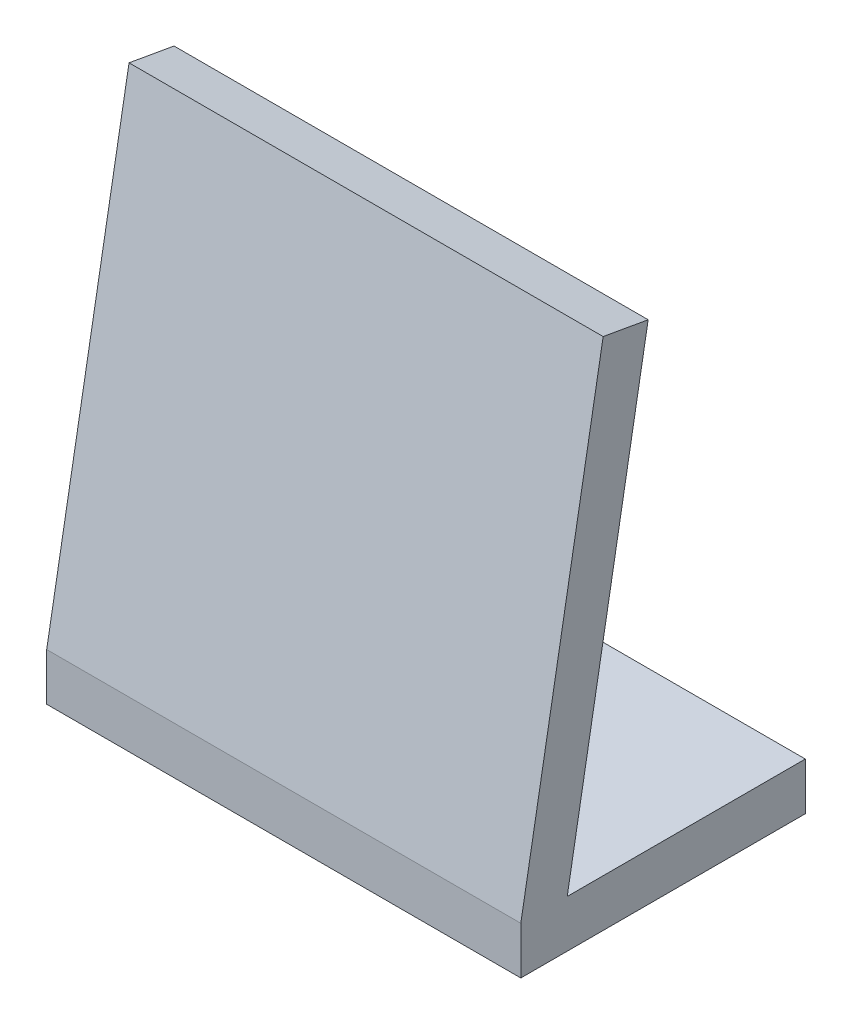
ISO-10303-21;
HEADER;
FILE_DESCRIPTION(('STEP AP214'),'2;1');
FILE_NAME('part.step','',(''),(''),'','','');
FILE_SCHEMA(('AUTOMOTIVE_DESIGN { 1 0 10303 214 1 1 1 1 }'));
ENDSEC;
DATA;
#1=APPLICATION_CONTEXT('core data for automotive mechanical design processes');
#2=APPLICATION_PROTOCOL_DEFINITION('international standard','automotive_design',2000,#1);
#3=PRODUCT_CONTEXT('',#1,'mechanical');
#4=PRODUCT('Part','Part','',(#3));
#5=PRODUCT_RELATED_PRODUCT_CATEGORY('part','',(#4));
#6=PRODUCT_DEFINITION_FORMATION('','',#4);
#7=PRODUCT_DEFINITION_CONTEXT('part definition',#1,'design');
#8=PRODUCT_DEFINITION('design','',#6,#7);
#9=PRODUCT_DEFINITION_SHAPE('','',#8);
#10=(LENGTH_UNIT() NAMED_UNIT(*) SI_UNIT(.MILLI.,.METRE.));
#11=(NAMED_UNIT(*) PLANE_ANGLE_UNIT() SI_UNIT($,.RADIAN.));
#12=(NAMED_UNIT(*) SI_UNIT($,.STERADIAN.) SOLID_ANGLE_UNIT());
#13=UNCERTAINTY_MEASURE_WITH_UNIT(LENGTH_MEASURE(1.E-05),#10,'distance_accuracy_value','');
#14=(GEOMETRIC_REPRESENTATION_CONTEXT(3) GLOBAL_UNCERTAINTY_ASSIGNED_CONTEXT((#13)) GLOBAL_UNIT_ASSIGNED_CONTEXT((#10,
#11,#12)) REPRESENTATION_CONTEXT('',''));
#15=CARTESIAN_POINT('',(0.,0.,0.));
#16=DIRECTION('',(0.,0.,1.));
#17=DIRECTION('',(1.,0.,0.));
#18=AXIS2_PLACEMENT_3D('',#15,#16,#17);
#19=CARTESIAN_POINT('',(-12.5,2.5,-7.5));
#20=DIRECTION('',(1.,0.,0.));
#21=DIRECTION('',(0.,0.,-1.));
#22=AXIS2_PLACEMENT_3D('',#19,#20,#21);
#23=PLANE('',#22);
#24=DIRECTION('',(0.,-0.984807753012208,0.173648177666928));
#25=VECTOR('',#24,1.);
#26=CARTESIAN_POINT('',(-12.5,26.7017401427995,0.785626796380141));
#27=LINE('',#26,#25);
#28=CARTESIAN_POINT('',(-12.5,26.7017401427995,0.785626796380141));
#29=VERTEX_POINT('',#28);
#30=CARTESIAN_POINT('',(-12.5,2.5,5.05304656365077));
#31=VERTEX_POINT('',#30);
#32=EDGE_CURVE('E125',#29,#31,#27,.T.);
#33=ORIENTED_EDGE('',*,*,#32,.T.);
#34=DIRECTION('',(0.,0.,1.));
#35=VECTOR('',#34,1.);
#36=CARTESIAN_POINT('',(-12.5,2.5,-7.5));
#37=LINE('',#36,#35);
#38=CARTESIAN_POINT('',(-12.5,2.5,-7.5));
#39=VERTEX_POINT('',#38);
#40=EDGE_CURVE('E57',#39,#31,#37,.T.);
#41=ORIENTED_EDGE('',*,*,#40,.F.);
#42=DIRECTION('',(0.,-1.,0.));
#43=VECTOR('',#42,1.);
#44=CARTESIAN_POINT('',(-12.5,2.5,-7.5));
#45=LINE('',#44,#43);
#46=CARTESIAN_POINT('',(-12.5,0.,-7.5));
#47=VERTEX_POINT('',#46);
#48=EDGE_CURVE('E148',#39,#47,#45,.T.);
#49=ORIENTED_EDGE('',*,*,#48,.T.);
#50=DIRECTION('',(0.,0.,1.));
#51=VECTOR('',#50,1.);
#52=CARTESIAN_POINT('',(-12.5,0.,-7.5));
#53=LINE('',#52,#51);
#54=CARTESIAN_POINT('',(-12.5,0.,7.5));
#55=VERTEX_POINT('',#54);
#56=EDGE_CURVE('E135',#47,#55,#53,.T.);
#57=ORIENTED_EDGE('',*,*,#56,.T.);
#58=DIRECTION('',(0.,-1.,0.));
#59=VECTOR('',#58,1.);
#60=CARTESIAN_POINT('',(-12.5,2.5,7.5));
#61=LINE('',#60,#59);
#62=CARTESIAN_POINT('',(-12.5,2.5,7.5));
#63=VERTEX_POINT('',#62);
#64=EDGE_CURVE('E47',#63,#55,#61,.T.);
#65=ORIENTED_EDGE('',*,*,#64,.F.);
#66=DIRECTION('',(0.,0.984807753012209,-0.173648177666928));
#67=VECTOR('',#66,1.);
#68=CARTESIAN_POINT('',(-12.5,27.1201938253052,3.15879555832681));
#69=LINE('',#68,#67);
#70=CARTESIAN_POINT('',(-12.5,27.1201938253052,3.15879555832681));
#71=VERTEX_POINT('',#70);
#72=EDGE_CURVE('E129',#63,#71,#69,.T.);
#73=ORIENTED_EDGE('',*,*,#72,.T.);
#74=DIRECTION('',(0.,-0.173648177666928,-0.984807753012208));
#75=VECTOR('',#74,1.);
#76=CARTESIAN_POINT('',(-12.5,26.7017401427995,0.785626796380141));
#77=LINE('',#76,#75);
#78=EDGE_CURVE('E100',#71,#29,#77,.T.);
#79=ORIENTED_EDGE('',*,*,#78,.T.);
#80=EDGE_LOOP('',(#33,#41,#49,#57,#65,#73,#79));
#81=FACE_BOUND('',#80,.T.);
#82=ADVANCED_FACE('F39',(#81),#23,.F.);
#83=CARTESIAN_POINT('',(-12.5,2.5,7.5));
#84=DIRECTION('',(0.,0.,-1.));
#85=DIRECTION('',(-1.,0.,0.));
#86=AXIS2_PLACEMENT_3D('',#83,#84,#85);
#87=PLANE('',#86);
#88=DIRECTION('',(1.,0.,0.));
#89=VECTOR('',#88,1.);
#90=CARTESIAN_POINT('',(-12.5,0.,7.5));
#91=LINE('',#90,#89);
#92=CARTESIAN_POINT('',(12.5,0.,7.5));
#93=VERTEX_POINT('',#92);
#94=EDGE_CURVE('E152',#55,#93,#91,.T.);
#95=ORIENTED_EDGE('',*,*,#94,.T.);
#96=DIRECTION('',(0.,-1.,0.));
#97=VECTOR('',#96,1.);
#98=CARTESIAN_POINT('',(12.5,2.5,7.5));
#99=LINE('',#98,#97);
#100=CARTESIAN_POINT('',(12.5,2.5,7.5));
#101=VERTEX_POINT('',#100);
#102=EDGE_CURVE('E167',#101,#93,#99,.T.);
#103=ORIENTED_EDGE('',*,*,#102,.F.);
#104=DIRECTION('',(1.,0.,0.));
#105=VECTOR('',#104,1.);
#106=CARTESIAN_POINT('',(-12.5,2.5,7.5));
#107=LINE('',#106,#105);
#108=EDGE_CURVE('E112',#63,#101,#107,.T.);
#109=ORIENTED_EDGE('',*,*,#108,.F.);
#110=ORIENTED_EDGE('',*,*,#64,.T.);
#111=EDGE_LOOP('',(#95,#103,#109,#110));
#112=FACE_BOUND('',#111,.T.);
#113=ADVANCED_FACE('F172',(#112),#87,.F.);
#114=CARTESIAN_POINT('',(12.5,2.5,-7.5));
#115=DIRECTION('',(-1.,0.,0.));
#116=DIRECTION('',(0.,0.,1.));
#117=AXIS2_PLACEMENT_3D('',#114,#115,#116);
#118=PLANE('',#117);
#119=DIRECTION('',(0.,0.,-1.));
#120=VECTOR('',#119,1.);
#121=CARTESIAN_POINT('',(12.5,2.5,-7.5));
#122=LINE('',#121,#120);
#123=CARTESIAN_POINT('',(12.5,2.5,5.05304656365077));
#124=VERTEX_POINT('',#123);
#125=CARTESIAN_POINT('',(12.5,2.5,-7.5));
#126=VERTEX_POINT('',#125);
#127=EDGE_CURVE('E142',#124,#126,#122,.T.);
#128=ORIENTED_EDGE('',*,*,#127,.F.);
#129=DIRECTION('',(0.,-0.984807753012208,0.173648177666928));
#130=VECTOR('',#129,1.);
#131=CARTESIAN_POINT('',(12.5,26.7017401427995,0.785626796380141));
#132=LINE('',#131,#130);
#133=CARTESIAN_POINT('',(12.5,26.7017401427995,0.785626796380141));
#134=VERTEX_POINT('',#133);
#135=EDGE_CURVE('E116',#134,#124,#132,.T.);
#136=ORIENTED_EDGE('',*,*,#135,.F.);
#137=DIRECTION('',(0.,-0.173648177666928,-0.984807753012208));
#138=VECTOR('',#137,1.);
#139=CARTESIAN_POINT('',(12.5,26.7017401427995,0.785626796380141));
#140=LINE('',#139,#138);
#141=CARTESIAN_POINT('',(12.5,27.1201938253052,3.15879555832681));
#142=VERTEX_POINT('',#141);
#143=EDGE_CURVE('E98',#142,#134,#140,.T.);
#144=ORIENTED_EDGE('',*,*,#143,.F.);
#145=DIRECTION('',(0.,0.984807753012209,-0.173648177666928));
#146=VECTOR('',#145,1.);
#147=CARTESIAN_POINT('',(12.5,27.1201938253052,3.15879555832681));
#148=LINE('',#147,#146);
#149=EDGE_CURVE('E109',#101,#142,#148,.T.);
#150=ORIENTED_EDGE('',*,*,#149,.F.);
#151=ORIENTED_EDGE('',*,*,#102,.T.);
#152=DIRECTION('',(0.,0.,-1.));
#153=VECTOR('',#152,1.);
#154=CARTESIAN_POINT('',(12.5,0.,-7.5));
#155=LINE('',#154,#153);
#156=CARTESIAN_POINT('',(12.5,0.,-7.5));
#157=VERTEX_POINT('',#156);
#158=EDGE_CURVE('E155',#93,#157,#155,.T.);
#159=ORIENTED_EDGE('',*,*,#158,.T.);
#160=DIRECTION('',(0.,-1.,0.));
#161=VECTOR('',#160,1.);
#162=CARTESIAN_POINT('',(12.5,2.5,-7.5));
#163=LINE('',#162,#161);
#164=EDGE_CURVE('E163',#126,#157,#163,.T.);
#165=ORIENTED_EDGE('',*,*,#164,.F.);
#166=EDGE_LOOP('',(#128,#136,#144,#150,#151,#159,#165));
#167=FACE_BOUND('',#166,.T.);
#168=ADVANCED_FACE('F119',(#167),#118,.F.);
#169=CARTESIAN_POINT('',(-12.5,2.5,-7.5));
#170=DIRECTION('',(0.,0.,1.));
#171=DIRECTION('',(1.,0.,0.));
#172=AXIS2_PLACEMENT_3D('',#169,#170,#171);
#173=PLANE('',#172);
#174=DIRECTION('',(-1.,0.,0.));
#175=VECTOR('',#174,1.);
#176=CARTESIAN_POINT('',(-12.5,0.,-7.5));
#177=LINE('',#176,#175);
#178=EDGE_CURVE('E139',#157,#47,#177,.T.);
#179=ORIENTED_EDGE('',*,*,#178,.T.);
#180=ORIENTED_EDGE('',*,*,#48,.F.);
#181=DIRECTION('',(-1.,0.,0.));
#182=VECTOR('',#181,1.);
#183=CARTESIAN_POINT('',(-12.5,2.5,-7.5));
#184=LINE('',#183,#182);
#185=EDGE_CURVE('E145',#126,#39,#184,.T.);
#186=ORIENTED_EDGE('',*,*,#185,.F.);
#187=ORIENTED_EDGE('',*,*,#164,.T.);
#188=EDGE_LOOP('',(#179,#180,#186,#187));
#189=FACE_BOUND('',#188,.T.);
#190=ADVANCED_FACE('F183',(#189),#173,.F.);
#191=CARTESIAN_POINT('',(0.,2.5,0.));
#192=DIRECTION('',(0.,1.,0.));
#193=DIRECTION('',(0.,0.,1.));
#194=AXIS2_PLACEMENT_3D('',#191,#192,#193);
#195=PLANE('',#194);
#196=DIRECTION('',(-1.,0.,0.));
#197=VECTOR('',#196,1.);
#198=CARTESIAN_POINT('',(0.,2.5,5.05304656365077));
#199=LINE('',#198,#197);
#200=EDGE_CURVE('E11',#124,#31,#199,.T.);
#201=ORIENTED_EDGE('',*,*,#200,.F.);
#202=ORIENTED_EDGE('',*,*,#127,.T.);
#203=ORIENTED_EDGE('',*,*,#185,.T.);
#204=ORIENTED_EDGE('',*,*,#40,.T.);
#205=EDGE_LOOP('',(#201,#202,#203,#204));
#206=FACE_BOUND('',#205,.T.);
#207=ADVANCED_FACE('F184',(#206),#195,.T.);
#208=CARTESIAN_POINT('',(0.,0.,0.));
#209=DIRECTION('',(0.,1.,0.));
#210=DIRECTION('',(0.,0.,1.));
#211=AXIS2_PLACEMENT_3D('',#208,#209,#210);
#212=PLANE('',#211);
#213=ORIENTED_EDGE('',*,*,#56,.F.);
#214=ORIENTED_EDGE('',*,*,#178,.F.);
#215=ORIENTED_EDGE('',*,*,#158,.F.);
#216=ORIENTED_EDGE('',*,*,#94,.F.);
#217=EDGE_LOOP('',(#213,#214,#215,#216));
#218=FACE_BOUND('',#217,.T.);
#219=ADVANCED_FACE('F178',(#218),#212,.F.);
#220=CARTESIAN_POINT('',(12.5,26.7017401427995,0.785626796380141));
#221=DIRECTION('',(0.,-0.173648177666928,-0.984807753012208));
#222=DIRECTION('',(0.,0.984807753012209,-0.173648177666928));
#223=AXIS2_PLACEMENT_3D('',#220,#221,#222);
#224=PLANE('',#223);
#225=ORIENTED_EDGE('',*,*,#135,.T.);
#226=ORIENTED_EDGE('',*,*,#200,.T.);
#227=ORIENTED_EDGE('',*,*,#32,.F.);
#228=DIRECTION('',(-1.,0.,0.));
#229=VECTOR('',#228,1.);
#230=CARTESIAN_POINT('',(12.5,26.7017401427995,0.785626796380141));
#231=LINE('',#230,#229);
#232=EDGE_CURVE('E105',#134,#29,#231,.T.);
#233=ORIENTED_EDGE('',*,*,#232,.F.);
#234=EDGE_LOOP('',(#225,#226,#227,#233));
#235=FACE_BOUND('',#234,.T.);
#236=ADVANCED_FACE('F186',(#235),#224,.T.);
#237=CARTESIAN_POINT('',(12.5,26.7017401427995,0.785626796380141));
#238=DIRECTION('',(0.,0.984807753012208,-0.173648177666928));
#239=DIRECTION('',(0.,0.173648177666928,0.984807753012208));
#240=AXIS2_PLACEMENT_3D('',#237,#238,#239);
#241=PLANE('',#240);
#242=ORIENTED_EDGE('',*,*,#78,.F.);
#243=DIRECTION('',(-1.,0.,0.));
#244=VECTOR('',#243,1.);
#245=CARTESIAN_POINT('',(12.5,27.1201938253052,3.15879555832681));
#246=LINE('',#245,#244);
#247=EDGE_CURVE('E94',#142,#71,#246,.T.);
#248=ORIENTED_EDGE('',*,*,#247,.F.);
#249=ORIENTED_EDGE('',*,*,#143,.T.);
#250=ORIENTED_EDGE('',*,*,#232,.T.);
#251=EDGE_LOOP('',(#242,#248,#249,#250));
#252=FACE_BOUND('',#251,.T.);
#253=ADVANCED_FACE('F96',(#252),#241,.T.);
#254=CARTESIAN_POINT('',(12.5,27.1201938253052,3.15879555832681));
#255=DIRECTION('',(0.,0.173648177666928,0.984807753012209));
#256=DIRECTION('',(0.,-0.984807753012209,0.173648177666928));
#257=AXIS2_PLACEMENT_3D('',#254,#255,#256);
#258=PLANE('',#257);
#259=ORIENTED_EDGE('',*,*,#72,.F.);
#260=ORIENTED_EDGE('',*,*,#108,.T.);
#261=ORIENTED_EDGE('',*,*,#149,.T.);
#262=ORIENTED_EDGE('',*,*,#247,.T.);
#263=EDGE_LOOP('',(#259,#260,#261,#262));
#264=FACE_BOUND('',#263,.T.);
#265=ADVANCED_FACE('F110',(#264),#258,.T.);
#266=CLOSED_SHELL('',(#82,#113,#168,#190,#207,#219,#236,#253,#265));
#267=MANIFOLD_SOLID_BREP('B2',#266);
#268=ADVANCED_BREP_SHAPE_REPRESENTATION('',(#18,#267),#14);
#269=SHAPE_DEFINITION_REPRESENTATION(#9,#268);
ENDSEC;
END-ISO-10303-21;
